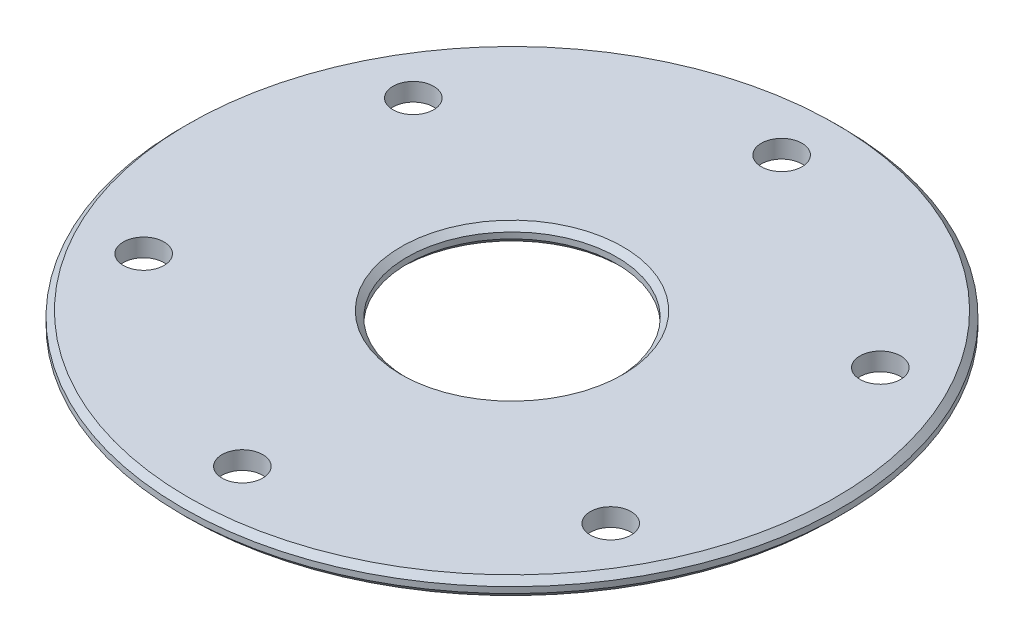
ISO-10303-21;
HEADER;
FILE_DESCRIPTION(('STEP AP214'),'2;1');
FILE_NAME('part.step','',(''),(''),'','','');
FILE_SCHEMA(('AUTOMOTIVE_DESIGN { 1 0 10303 214 1 1 1 1 }'));
ENDSEC;
DATA;
#1=APPLICATION_CONTEXT('core data for automotive mechanical design processes');
#2=APPLICATION_PROTOCOL_DEFINITION('international standard','automotive_design',2000,#1);
#3=PRODUCT_CONTEXT('',#1,'mechanical');
#4=PRODUCT('Part','Part','',(#3));
#5=PRODUCT_RELATED_PRODUCT_CATEGORY('part','',(#4));
#6=PRODUCT_DEFINITION_FORMATION('','',#4);
#7=PRODUCT_DEFINITION_CONTEXT('part definition',#1,'design');
#8=PRODUCT_DEFINITION('design','',#6,#7);
#9=PRODUCT_DEFINITION_SHAPE('','',#8);
#10=(LENGTH_UNIT() NAMED_UNIT(*) SI_UNIT(.MILLI.,.METRE.));
#11=(NAMED_UNIT(*) PLANE_ANGLE_UNIT() SI_UNIT($,.RADIAN.));
#12=(NAMED_UNIT(*) SI_UNIT($,.STERADIAN.) SOLID_ANGLE_UNIT());
#13=UNCERTAINTY_MEASURE_WITH_UNIT(LENGTH_MEASURE(1.E-05),#10,'distance_accuracy_value','');
#14=(GEOMETRIC_REPRESENTATION_CONTEXT(3) GLOBAL_UNCERTAINTY_ASSIGNED_CONTEXT((#13)) GLOBAL_UNIT_ASSIGNED_CONTEXT((#10,
#11,#12)) REPRESENTATION_CONTEXT('',''));
#15=CARTESIAN_POINT('',(0.,0.,0.));
#16=DIRECTION('',(0.,0.,1.));
#17=DIRECTION('',(1.,0.,0.));
#18=AXIS2_PLACEMENT_3D('',#15,#16,#17);
#19=CARTESIAN_POINT('',(0.,3.,0.));
#20=DIRECTION('',(0.,-1.,0.));
#21=DIRECTION('',(0.,0.,-1.));
#22=AXIS2_PLACEMENT_3D('',#19,#20,#21);
#23=CYLINDRICAL_SURFACE('',#22,55.);
#24=CARTESIAN_POINT('',(0.,2.,0.));
#25=DIRECTION('',(0.,1.,0.));
#26=DIRECTION('',(0.,0.,1.));
#27=AXIS2_PLACEMENT_3D('',#24,#25,#26);
#28=CIRCLE('',#27,55.);
#29=CARTESIAN_POINT('',(0.,2.,55.));
#30=VERTEX_POINT('',#29);
#31=EDGE_CURVE('E60',#30,#30,#28,.F.);
#32=ORIENTED_EDGE('',*,*,#31,.T.);
#33=EDGE_LOOP('',(#32));
#34=FACE_BOUND('',#33,.T.);
#35=CARTESIAN_POINT('',(0.,1.,0.));
#36=DIRECTION('',(0.,1.,0.));
#37=DIRECTION('',(0.,0.,1.));
#38=AXIS2_PLACEMENT_3D('',#35,#36,#37);
#39=CIRCLE('',#38,55.);
#40=CARTESIAN_POINT('',(0.,1.,55.));
#41=VERTEX_POINT('',#40);
#42=EDGE_CURVE('E63',#41,#41,#39,.T.);
#43=ORIENTED_EDGE('',*,*,#42,.T.);
#44=EDGE_LOOP('',(#43));
#45=FACE_BOUND('',#44,.T.);
#46=ADVANCED_FACE('F36',(#34,#45),#23,.T.);
#47=CARTESIAN_POINT('',(0.,3.,0.));
#48=DIRECTION('',(0.,1.,0.));
#49=DIRECTION('',(0.,0.,1.));
#50=AXIS2_PLACEMENT_3D('',#47,#48,#49);
#51=PLANE('',#50);
#52=CARTESIAN_POINT('',(0.,3.,0.));
#53=DIRECTION('',(0.,1.,0.));
#54=DIRECTION('',(0.,0.,1.));
#55=AXIS2_PLACEMENT_3D('',#52,#53,#54);
#56=CIRCLE('',#55,18.5);
#57=CARTESIAN_POINT('',(0.,3.,18.5));
#58=VERTEX_POINT('',#57);
#59=EDGE_CURVE('E44',#58,#58,#56,.F.);
#60=ORIENTED_EDGE('',*,*,#59,.T.);
#61=EDGE_LOOP('',(#60));
#62=FACE_BOUND('',#61,.T.);
#63=CARTESIAN_POINT('',(0.,3.,0.));
#64=DIRECTION('',(0.,1.,0.));
#65=DIRECTION('',(0.,0.,1.));
#66=AXIS2_PLACEMENT_3D('',#63,#64,#65);
#67=CIRCLE('',#66,54.);
#68=CARTESIAN_POINT('',(0.,3.,54.));
#69=VERTEX_POINT('',#68);
#70=EDGE_CURVE('E66',#69,#69,#67,.T.);
#71=ORIENTED_EDGE('',*,*,#70,.T.);
#72=EDGE_LOOP('',(#71));
#73=FACE_BOUND('',#72,.T.);
#74=CARTESIAN_POINT('',(38.9711431702995,3.,-22.5000000000005));
#75=DIRECTION('',(0.,1.,0.));
#76=DIRECTION('',(-0.866025403784433,0.,0.50000000000001));
#77=AXIS2_PLACEMENT_3D('',#74,#75,#76);
#78=CIRCLE('',#77,3.39999999999999);
#79=CARTESIAN_POINT('',(36.0266567974324,3.,-20.8000000000004));
#80=VERTEX_POINT('',#79);
#81=EDGE_CURVE('E86',#80,#80,#78,.T.);
#82=ORIENTED_EDGE('',*,*,#81,.F.);
#83=EDGE_LOOP('',(#82));
#84=FACE_BOUND('',#83,.T.);
#85=CARTESIAN_POINT('',(38.9711431703,3.,22.4999999999996));
#86=DIRECTION('',(0.,1.,0.));
#87=DIRECTION('',(-0.866025403784443,0.,-0.499999999999992));
#88=AXIS2_PLACEMENT_3D('',#85,#86,#87);
#89=CIRCLE('',#88,3.39999999999999);
#90=CARTESIAN_POINT('',(36.0266567974328,3.,20.7999999999997));
#91=VERTEX_POINT('',#90);
#92=EDGE_CURVE('E85',#91,#91,#89,.T.);
#93=ORIENTED_EDGE('',*,*,#92,.F.);
#94=EDGE_LOOP('',(#93));
#95=FACE_BOUND('',#94,.T.);
#96=CARTESIAN_POINT('',(0.,3.,45.));
#97=DIRECTION('',(0.,1.,0.));
#98=DIRECTION('',(0.,0.,-1.));
#99=AXIS2_PLACEMENT_3D('',#96,#97,#98);
#100=CIRCLE('',#99,3.39999999999999);
#101=CARTESIAN_POINT('',(0.,3.,41.6));
#102=VERTEX_POINT('',#101);
#103=EDGE_CURVE('E92',#102,#102,#100,.T.);
#104=ORIENTED_EDGE('',*,*,#103,.F.);
#105=EDGE_LOOP('',(#104));
#106=FACE_BOUND('',#105,.T.);
#107=CARTESIAN_POINT('',(-38.9711431702996,3.,22.5000000000002));
#108=DIRECTION('',(0.,1.,0.));
#109=DIRECTION('',(0.866025403784436,0.,-0.500000000000004));
#110=AXIS2_PLACEMENT_3D('',#107,#108,#109);
#111=CIRCLE('',#110,3.39999999999999);
#112=CARTESIAN_POINT('',(-36.0266567974326,3.,20.8000000000002));
#113=VERTEX_POINT('',#112);
#114=EDGE_CURVE('E98',#113,#113,#111,.T.);
#115=ORIENTED_EDGE('',*,*,#114,.F.);
#116=EDGE_LOOP('',(#115));
#117=FACE_BOUND('',#116,.T.);
#118=CARTESIAN_POINT('',(-38.9711431702998,3.,-22.4999999999999));
#119=DIRECTION('',(0.,1.,0.));
#120=DIRECTION('',(0.86602540378444,0.,0.499999999999998));
#121=AXIS2_PLACEMENT_3D('',#118,#119,#120);
#122=CIRCLE('',#121,3.39999999999999);
#123=CARTESIAN_POINT('',(-36.0266567974327,3.,-20.7999999999999));
#124=VERTEX_POINT('',#123);
#125=EDGE_CURVE('E78',#124,#124,#122,.T.);
#126=ORIENTED_EDGE('',*,*,#125,.F.);
#127=EDGE_LOOP('',(#126));
#128=FACE_BOUND('',#127,.T.);
#129=CARTESIAN_POINT('',(0.,3.,-45.));
#130=DIRECTION('',(0.,1.,0.));
#131=DIRECTION('',(0.,0.,1.));
#132=AXIS2_PLACEMENT_3D('',#129,#130,#131);
#133=CIRCLE('',#132,3.39999999999999);
#134=CARTESIAN_POINT('',(0.,3.,-41.6));
#135=VERTEX_POINT('',#134);
#136=EDGE_CURVE('E72',#135,#135,#133,.T.);
#137=ORIENTED_EDGE('',*,*,#136,.F.);
#138=EDGE_LOOP('',(#137));
#139=FACE_BOUND('',#138,.T.);
#140=ADVANCED_FACE('F109',(#62,#73,#84,#95,#106,#117,#128,#139),#51,.T.);
#141=CARTESIAN_POINT('',(0.,0.,0.));
#142=DIRECTION('',(0.,1.,0.));
#143=DIRECTION('',(0.,0.,1.));
#144=AXIS2_PLACEMENT_3D('',#141,#142,#143);
#145=PLANE('',#144);
#146=CARTESIAN_POINT('',(0.,0.,0.));
#147=DIRECTION('',(0.,1.,0.));
#148=DIRECTION('',(0.,0.,1.));
#149=AXIS2_PLACEMENT_3D('',#146,#147,#148);
#150=CIRCLE('',#149,18.5);
#151=CARTESIAN_POINT('',(0.,0.,18.5));
#152=VERTEX_POINT('',#151);
#153=EDGE_CURVE('E10',#152,#152,#150,.T.);
#154=ORIENTED_EDGE('',*,*,#153,.T.);
#155=EDGE_LOOP('',(#154));
#156=FACE_BOUND('',#155,.T.);
#157=CARTESIAN_POINT('',(0.,0.,0.));
#158=DIRECTION('',(0.,1.,0.));
#159=DIRECTION('',(0.,0.,1.));
#160=AXIS2_PLACEMENT_3D('',#157,#158,#159);
#161=CIRCLE('',#160,54.);
#162=CARTESIAN_POINT('',(0.,0.,54.));
#163=VERTEX_POINT('',#162);
#164=EDGE_CURVE('E57',#163,#163,#161,.F.);
#165=ORIENTED_EDGE('',*,*,#164,.T.);
#166=EDGE_LOOP('',(#165));
#167=FACE_BOUND('',#166,.T.);
#168=CARTESIAN_POINT('',(38.9711431702995,0.,-22.5000000000005));
#169=DIRECTION('',(0.,1.,0.));
#170=DIRECTION('',(-0.866025403784433,0.,0.50000000000001));
#171=AXIS2_PLACEMENT_3D('',#168,#169,#170);
#172=CIRCLE('',#171,3.39999999999999);
#173=CARTESIAN_POINT('',(36.0266567974324,0.,-20.8000000000004));
#174=VERTEX_POINT('',#173);
#175=EDGE_CURVE('E82',#174,#174,#172,.T.);
#176=ORIENTED_EDGE('',*,*,#175,.T.);
#177=EDGE_LOOP('',(#176));
#178=FACE_BOUND('',#177,.T.);
#179=CARTESIAN_POINT('',(38.9711431703,0.,22.4999999999996));
#180=DIRECTION('',(0.,1.,0.));
#181=DIRECTION('',(-0.866025403784443,0.,-0.499999999999992));
#182=AXIS2_PLACEMENT_3D('',#179,#180,#181);
#183=CIRCLE('',#182,3.39999999999999);
#184=CARTESIAN_POINT('',(36.0266567974329,0.,20.7999999999997));
#185=VERTEX_POINT('',#184);
#186=EDGE_CURVE('E89',#185,#185,#183,.T.);
#187=ORIENTED_EDGE('',*,*,#186,.T.);
#188=EDGE_LOOP('',(#187));
#189=FACE_BOUND('',#188,.T.);
#190=CARTESIAN_POINT('',(0.,0.,45.));
#191=DIRECTION('',(0.,1.,0.));
#192=DIRECTION('',(0.,0.,-1.));
#193=AXIS2_PLACEMENT_3D('',#190,#191,#192);
#194=CIRCLE('',#193,3.39999999999999);
#195=CARTESIAN_POINT('',(0.,0.,41.6));
#196=VERTEX_POINT('',#195);
#197=EDGE_CURVE('E95',#196,#196,#194,.T.);
#198=ORIENTED_EDGE('',*,*,#197,.T.);
#199=EDGE_LOOP('',(#198));
#200=FACE_BOUND('',#199,.T.);
#201=CARTESIAN_POINT('',(-38.9711431702996,0.,22.5000000000002));
#202=DIRECTION('',(0.,1.,0.));
#203=DIRECTION('',(0.866025403784436,0.,-0.500000000000004));
#204=AXIS2_PLACEMENT_3D('',#201,#202,#203);
#205=CIRCLE('',#204,3.39999999999999);
#206=CARTESIAN_POINT('',(-36.0266567974326,0.,20.8000000000002));
#207=VERTEX_POINT('',#206);
#208=EDGE_CURVE('E81',#207,#207,#205,.T.);
#209=ORIENTED_EDGE('',*,*,#208,.T.);
#210=EDGE_LOOP('',(#209));
#211=FACE_BOUND('',#210,.T.);
#212=CARTESIAN_POINT('',(-38.9711431702998,0.,-22.4999999999999));
#213=DIRECTION('',(0.,1.,0.));
#214=DIRECTION('',(0.86602540378444,0.,0.499999999999998));
#215=AXIS2_PLACEMENT_3D('',#212,#213,#214);
#216=CIRCLE('',#215,3.39999999999999);
#217=CARTESIAN_POINT('',(-36.0266567974327,0.,-20.7999999999999));
#218=VERTEX_POINT('',#217);
#219=EDGE_CURVE('E75',#218,#218,#216,.T.);
#220=ORIENTED_EDGE('',*,*,#219,.T.);
#221=EDGE_LOOP('',(#220));
#222=FACE_BOUND('',#221,.T.);
#223=CARTESIAN_POINT('',(0.,0.,-45.));
#224=DIRECTION('',(0.,1.,0.));
#225=DIRECTION('',(0.,0.,1.));
#226=AXIS2_PLACEMENT_3D('',#223,#224,#225);
#227=CIRCLE('',#226,3.39999999999999);
#228=CARTESIAN_POINT('',(0.,0.,-41.6));
#229=VERTEX_POINT('',#228);
#230=EDGE_CURVE('E69',#229,#229,#227,.T.);
#231=ORIENTED_EDGE('',*,*,#230,.T.);
#232=EDGE_LOOP('',(#231));
#233=FACE_BOUND('',#232,.T.);
#234=ADVANCED_FACE('F112',(#156,#167,#178,#189,#200,#211,#222,#233),#145,.F.);
#235=CARTESIAN_POINT('',(0.,3.,-45.));
#236=DIRECTION('',(0.,1.,0.));
#237=DIRECTION('',(0.,0.,1.));
#238=AXIS2_PLACEMENT_3D('',#235,#236,#237);
#239=CYLINDRICAL_SURFACE('',#238,3.39999999999999);
#240=ORIENTED_EDGE('',*,*,#136,.T.);
#241=EDGE_LOOP('',(#240));
#242=FACE_BOUND('',#241,.T.);
#243=ORIENTED_EDGE('',*,*,#230,.F.);
#244=EDGE_LOOP('',(#243));
#245=FACE_BOUND('',#244,.T.);
#246=ADVANCED_FACE('F118',(#242,#245),#239,.F.);
#247=CARTESIAN_POINT('',(-38.9711431702998,3.,-22.4999999999999));
#248=DIRECTION('',(0.,1.,0.));
#249=DIRECTION('',(0.86602540378444,0.,0.499999999999998));
#250=AXIS2_PLACEMENT_3D('',#247,#248,#249);
#251=CYLINDRICAL_SURFACE('',#250,3.39999999999999);
#252=ORIENTED_EDGE('',*,*,#125,.T.);
#253=EDGE_LOOP('',(#252));
#254=FACE_BOUND('',#253,.T.);
#255=ORIENTED_EDGE('',*,*,#219,.F.);
#256=EDGE_LOOP('',(#255));
#257=FACE_BOUND('',#256,.T.);
#258=ADVANCED_FACE('F121',(#254,#257),#251,.F.);
#259=CARTESIAN_POINT('',(-38.9711431702996,3.,22.5000000000002));
#260=DIRECTION('',(0.,1.,0.));
#261=DIRECTION('',(0.866025403784436,0.,-0.500000000000004));
#262=AXIS2_PLACEMENT_3D('',#259,#260,#261);
#263=CYLINDRICAL_SURFACE('',#262,3.39999999999999);
#264=ORIENTED_EDGE('',*,*,#114,.T.);
#265=EDGE_LOOP('',(#264));
#266=FACE_BOUND('',#265,.T.);
#267=ORIENTED_EDGE('',*,*,#208,.F.);
#268=EDGE_LOOP('',(#267));
#269=FACE_BOUND('',#268,.T.);
#270=ADVANCED_FACE('F106',(#266,#269),#263,.F.);
#271=CARTESIAN_POINT('',(0.,3.,45.));
#272=DIRECTION('',(0.,1.,0.));
#273=DIRECTION('',(0.,0.,-1.));
#274=AXIS2_PLACEMENT_3D('',#271,#272,#273);
#275=CYLINDRICAL_SURFACE('',#274,3.39999999999999);
#276=ORIENTED_EDGE('',*,*,#103,.T.);
#277=EDGE_LOOP('',(#276));
#278=FACE_BOUND('',#277,.T.);
#279=ORIENTED_EDGE('',*,*,#197,.F.);
#280=EDGE_LOOP('',(#279));
#281=FACE_BOUND('',#280,.T.);
#282=ADVANCED_FACE('F179',(#278,#281),#275,.F.);
#283=CARTESIAN_POINT('',(38.9711431703,3.,22.4999999999996));
#284=DIRECTION('',(0.,1.,0.));
#285=DIRECTION('',(-0.866025403784443,0.,-0.499999999999992));
#286=AXIS2_PLACEMENT_3D('',#283,#284,#285);
#287=CYLINDRICAL_SURFACE('',#286,3.39999999999999);
#288=ORIENTED_EDGE('',*,*,#92,.T.);
#289=EDGE_LOOP('',(#288));
#290=FACE_BOUND('',#289,.T.);
#291=ORIENTED_EDGE('',*,*,#186,.F.);
#292=EDGE_LOOP('',(#291));
#293=FACE_BOUND('',#292,.T.);
#294=ADVANCED_FACE('F173',(#290,#293),#287,.F.);
#295=CARTESIAN_POINT('',(38.9711431702995,3.,-22.5000000000005));
#296=DIRECTION('',(0.,1.,0.));
#297=DIRECTION('',(-0.866025403784433,0.,0.50000000000001));
#298=AXIS2_PLACEMENT_3D('',#295,#296,#297);
#299=CYLINDRICAL_SURFACE('',#298,3.39999999999999);
#300=ORIENTED_EDGE('',*,*,#81,.T.);
#301=EDGE_LOOP('',(#300));
#302=FACE_BOUND('',#301,.T.);
#303=ORIENTED_EDGE('',*,*,#175,.F.);
#304=EDGE_LOOP('',(#303));
#305=FACE_BOUND('',#304,.T.);
#306=ADVANCED_FACE('F166',(#302,#305),#299,.F.);
#307=CARTESIAN_POINT('',(0.,0.,0.));
#308=DIRECTION('',(0.,1.,0.));
#309=DIRECTION('',(0.,0.,1.));
#310=AXIS2_PLACEMENT_3D('',#307,#308,#309);
#311=CYLINDRICAL_SURFACE('',#310,17.5);
#312=CARTESIAN_POINT('',(0.,2.00000000000001,0.));
#313=DIRECTION('',(0.,1.,0.));
#314=DIRECTION('',(0.,0.,1.));
#315=AXIS2_PLACEMENT_3D('',#312,#313,#314);
#316=CIRCLE('',#315,17.5);
#317=CARTESIAN_POINT('',(0.,2.00000000000001,17.5));
#318=VERTEX_POINT('',#317);
#319=EDGE_CURVE('E48',#318,#318,#316,.T.);
#320=ORIENTED_EDGE('',*,*,#319,.T.);
#321=EDGE_LOOP('',(#320));
#322=FACE_BOUND('',#321,.T.);
#323=CARTESIAN_POINT('',(0.,1.00000000000001,0.));
#324=DIRECTION('',(0.,1.,0.));
#325=DIRECTION('',(0.,0.,1.));
#326=AXIS2_PLACEMENT_3D('',#323,#324,#325);
#327=CIRCLE('',#326,17.5);
#328=CARTESIAN_POINT('',(0.,1.00000000000001,17.5));
#329=VERTEX_POINT('',#328);
#330=EDGE_CURVE('E52',#329,#329,#327,.F.);
#331=ORIENTED_EDGE('',*,*,#330,.T.);
#332=EDGE_LOOP('',(#331));
#333=FACE_BOUND('',#332,.T.);
#334=ADVANCED_FACE('F145',(#322,#333),#311,.F.);
#335=CARTESIAN_POINT('',(0.,3.,0.));
#336=DIRECTION('',(0.,-1.,0.));
#337=DIRECTION('',(0.,0.,-1.));
#338=AXIS2_PLACEMENT_3D('',#335,#336,#337);
#339=CONICAL_SURFACE('',#338,54.,0.785398163397448);
#340=ORIENTED_EDGE('',*,*,#31,.F.);
#341=EDGE_LOOP('',(#340));
#342=FACE_BOUND('',#341,.T.);
#343=ORIENTED_EDGE('',*,*,#70,.F.);
#344=EDGE_LOOP('',(#343));
#345=FACE_BOUND('',#344,.T.);
#346=ADVANCED_FACE('F138',(#342,#345),#339,.T.);
#347=CARTESIAN_POINT('',(0.,1.,0.));
#348=DIRECTION('',(0.,1.,0.));
#349=DIRECTION('',(0.,0.,1.));
#350=AXIS2_PLACEMENT_3D('',#347,#348,#349);
#351=CONICAL_SURFACE('',#350,55.,0.785398163397455);
#352=ORIENTED_EDGE('',*,*,#164,.F.);
#353=EDGE_LOOP('',(#352));
#354=FACE_BOUND('',#353,.T.);
#355=ORIENTED_EDGE('',*,*,#42,.F.);
#356=EDGE_LOOP('',(#355));
#357=FACE_BOUND('',#356,.T.);
#358=ADVANCED_FACE('F144',(#354,#357),#351,.T.);
#359=CARTESIAN_POINT('',(0.,2.00000000000001,0.));
#360=DIRECTION('',(0.,1.,0.));
#361=DIRECTION('',(0.,0.,1.));
#362=AXIS2_PLACEMENT_3D('',#359,#360,#361);
#363=CONICAL_SURFACE('',#362,17.5,0.785398163397453);
#364=ORIENTED_EDGE('',*,*,#59,.F.);
#365=EDGE_LOOP('',(#364));
#366=FACE_BOUND('',#365,.T.);
#367=ORIENTED_EDGE('',*,*,#319,.F.);
#368=EDGE_LOOP('',(#367));
#369=FACE_BOUND('',#368,.T.);
#370=ADVANCED_FACE('F151',(#366,#369),#363,.F.);
#371=CARTESIAN_POINT('',(0.,0.,0.));
#372=DIRECTION('',(0.,-1.,0.));
#373=DIRECTION('',(0.,0.,-1.));
#374=AXIS2_PLACEMENT_3D('',#371,#372,#373);
#375=CONICAL_SURFACE('',#374,18.5,0.785398163397443);
#376=ORIENTED_EDGE('',*,*,#330,.F.);
#377=EDGE_LOOP('',(#376));
#378=FACE_BOUND('',#377,.T.);
#379=ORIENTED_EDGE('',*,*,#153,.F.);
#380=EDGE_LOOP('',(#379));
#381=FACE_BOUND('',#380,.T.);
#382=ADVANCED_FACE('F39',(#378,#381),#375,.F.);
#383=CLOSED_SHELL('',(#46,#140,#234,#246,#258,#270,#282,#294,#306,#334,#346,#358,#370,#382));
#384=MANIFOLD_SOLID_BREP('B2',#383);
#385=ADVANCED_BREP_SHAPE_REPRESENTATION('',(#18,#384),#14);
#386=SHAPE_DEFINITION_REPRESENTATION(#9,#385);
ENDSEC;
END-ISO-10303-21;
